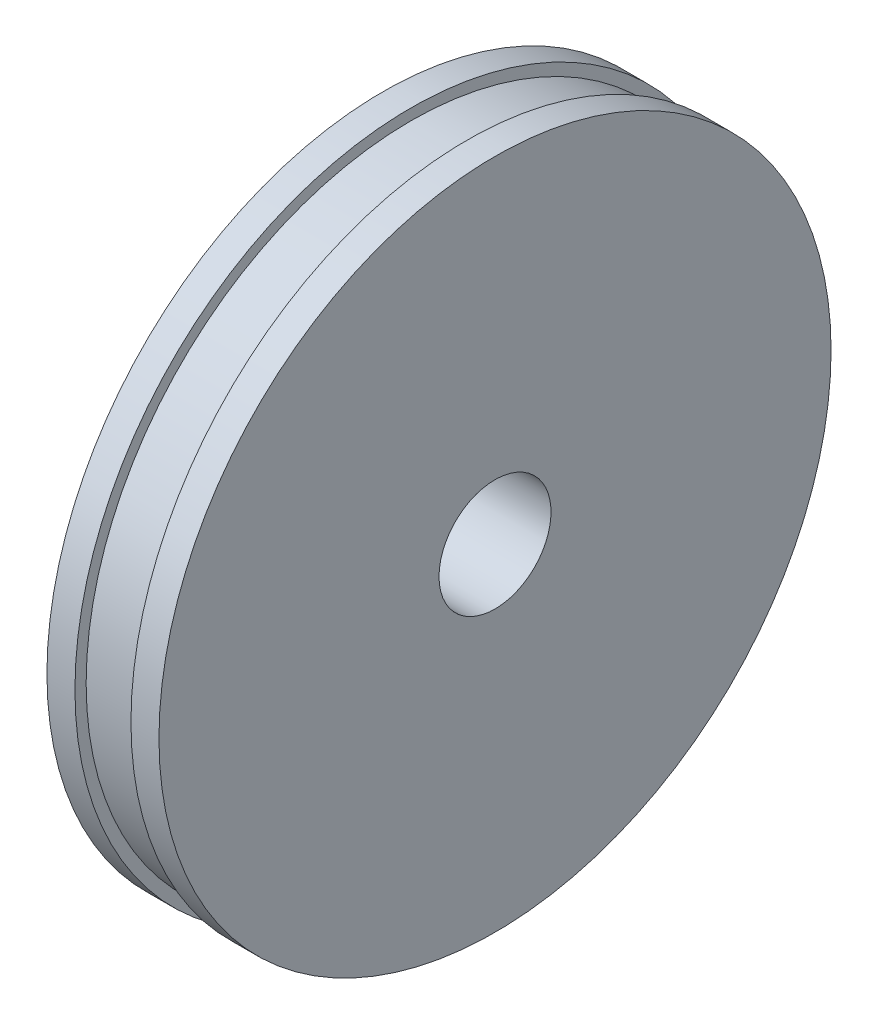
ISO-10303-21;
HEADER;
FILE_DESCRIPTION(('STEP AP214'),'2;1');
FILE_NAME('part.step','',(''),(''),'','','');
FILE_SCHEMA(('AUTOMOTIVE_DESIGN { 1 0 10303 214 1 1 1 1 }'));
ENDSEC;
DATA;
#1=APPLICATION_CONTEXT('core data for automotive mechanical design processes');
#2=APPLICATION_PROTOCOL_DEFINITION('international standard','automotive_design',2000,#1);
#3=PRODUCT_CONTEXT('',#1,'mechanical');
#4=PRODUCT('Part','Part','',(#3));
#5=PRODUCT_RELATED_PRODUCT_CATEGORY('part','',(#4));
#6=PRODUCT_DEFINITION_FORMATION('','',#4);
#7=PRODUCT_DEFINITION_CONTEXT('part definition',#1,'design');
#8=PRODUCT_DEFINITION('design','',#6,#7);
#9=PRODUCT_DEFINITION_SHAPE('','',#8);
#10=(LENGTH_UNIT() NAMED_UNIT(*) SI_UNIT(.MILLI.,.METRE.));
#11=(NAMED_UNIT(*) PLANE_ANGLE_UNIT() SI_UNIT($,.RADIAN.));
#12=(NAMED_UNIT(*) SI_UNIT($,.STERADIAN.) SOLID_ANGLE_UNIT());
#13=UNCERTAINTY_MEASURE_WITH_UNIT(LENGTH_MEASURE(1.E-05),#10,'distance_accuracy_value','');
#14=(GEOMETRIC_REPRESENTATION_CONTEXT(3) GLOBAL_UNCERTAINTY_ASSIGNED_CONTEXT((#13)) GLOBAL_UNIT_ASSIGNED_CONTEXT((#10,
#11,#12)) REPRESENTATION_CONTEXT('',''));
#15=CARTESIAN_POINT('',(0.,0.,0.));
#16=DIRECTION('',(0.,0.,1.));
#17=DIRECTION('',(1.,0.,0.));
#18=AXIS2_PLACEMENT_3D('',#15,#16,#17);
#19=CARTESIAN_POINT('',(0.,0.,0.));
#20=DIRECTION('',(1.,0.,0.));
#21=DIRECTION('',(0.,0.,-1.));
#22=AXIS2_PLACEMENT_3D('',#19,#20,#21);
#23=PLANE('',#22);
#24=CARTESIAN_POINT('',(0.,0.,0.));
#25=DIRECTION('',(-1.,0.,0.));
#26=DIRECTION('',(0.,0.,1.));
#27=AXIS2_PLACEMENT_3D('',#24,#25,#26);
#28=CIRCLE('',#27,50.);
#29=CARTESIAN_POINT('',(0.,0.,50.));
#30=VERTEX_POINT('',#29);
#31=EDGE_CURVE('E71',#30,#30,#28,.T.);
#32=ORIENTED_EDGE('',*,*,#31,.F.);
#33=EDGE_LOOP('',(#32));
#34=FACE_BOUND('',#33,.T.);
#35=CARTESIAN_POINT('',(0.,0.,0.));
#36=DIRECTION('',(-1.,0.,0.));
#37=DIRECTION('',(0.,0.,1.));
#38=AXIS2_PLACEMENT_3D('',#35,#36,#37);
#39=CIRCLE('',#38,300.);
#40=CARTESIAN_POINT('',(0.,0.,300.));
#41=VERTEX_POINT('',#40);
#42=EDGE_CURVE('E10',#41,#41,#39,.T.);
#43=ORIENTED_EDGE('',*,*,#42,.T.);
#44=EDGE_LOOP('',(#43));
#45=FACE_BOUND('',#44,.T.);
#46=ADVANCED_FACE('F39',(#34,#45),#23,.F.);
#47=CARTESIAN_POINT('',(0.,0.,0.));
#48=DIRECTION('',(-1.,0.,0.));
#49=DIRECTION('',(0.,0.,1.));
#50=AXIS2_PLACEMENT_3D('',#47,#48,#49);
#51=CYLINDRICAL_SURFACE('',#50,300.);
#52=ORIENTED_EDGE('',*,*,#42,.F.);
#53=EDGE_LOOP('',(#52));
#54=FACE_BOUND('',#53,.T.);
#55=CARTESIAN_POINT('',(25.,0.,0.));
#56=DIRECTION('',(-1.,0.,0.));
#57=DIRECTION('',(0.,0.,1.));
#58=AXIS2_PLACEMENT_3D('',#55,#56,#57);
#59=CIRCLE('',#58,300.);
#60=CARTESIAN_POINT('',(25.,0.,300.));
#61=VERTEX_POINT('',#60);
#62=EDGE_CURVE('E46',#61,#61,#59,.T.);
#63=ORIENTED_EDGE('',*,*,#62,.T.);
#64=EDGE_LOOP('',(#63));
#65=FACE_BOUND('',#64,.T.);
#66=ADVANCED_FACE('F89',(#54,#65),#51,.T.);
#67=CARTESIAN_POINT('',(25.,300.,0.));
#68=DIRECTION('',(-1.,0.,0.));
#69=DIRECTION('',(0.,0.,1.));
#70=AXIS2_PLACEMENT_3D('',#67,#68,#69);
#71=PLANE('',#70);
#72=ORIENTED_EDGE('',*,*,#62,.F.);
#73=EDGE_LOOP('',(#72));
#74=FACE_BOUND('',#73,.T.);
#75=CARTESIAN_POINT('',(25.,0.,0.));
#76=DIRECTION('',(-1.,0.,0.));
#77=DIRECTION('',(0.,0.,1.));
#78=AXIS2_PLACEMENT_3D('',#75,#76,#77);
#79=CIRCLE('',#78,290.);
#80=CARTESIAN_POINT('',(25.,0.,290.));
#81=VERTEX_POINT('',#80);
#82=EDGE_CURVE('E51',#81,#81,#79,.T.);
#83=ORIENTED_EDGE('',*,*,#82,.T.);
#84=EDGE_LOOP('',(#83));
#85=FACE_BOUND('',#84,.T.);
#86=ADVANCED_FACE('F93',(#74,#85),#71,.F.);
#87=CARTESIAN_POINT('',(0.,0.,0.));
#88=DIRECTION('',(-1.,0.,0.));
#89=DIRECTION('',(0.,0.,1.));
#90=AXIS2_PLACEMENT_3D('',#87,#88,#89);
#91=CYLINDRICAL_SURFACE('',#90,290.);
#92=ORIENTED_EDGE('',*,*,#82,.F.);
#93=EDGE_LOOP('',(#92));
#94=FACE_BOUND('',#93,.T.);
#95=CARTESIAN_POINT('',(75.,0.,0.));
#96=DIRECTION('',(-1.,0.,0.));
#97=DIRECTION('',(0.,0.,1.));
#98=AXIS2_PLACEMENT_3D('',#95,#96,#97);
#99=CIRCLE('',#98,290.);
#100=CARTESIAN_POINT('',(75.,0.,290.));
#101=VERTEX_POINT('',#100);
#102=EDGE_CURVE('E56',#101,#101,#99,.T.);
#103=ORIENTED_EDGE('',*,*,#102,.T.);
#104=EDGE_LOOP('',(#103));
#105=FACE_BOUND('',#104,.T.);
#106=ADVANCED_FACE('F98',(#94,#105),#91,.T.);
#107=CARTESIAN_POINT('',(75.,290.,0.));
#108=DIRECTION('',(1.,0.,0.));
#109=DIRECTION('',(0.,0.,-1.));
#110=AXIS2_PLACEMENT_3D('',#107,#108,#109);
#111=PLANE('',#110);
#112=ORIENTED_EDGE('',*,*,#102,.F.);
#113=EDGE_LOOP('',(#112));
#114=FACE_BOUND('',#113,.T.);
#115=CARTESIAN_POINT('',(75.,0.,0.));
#116=DIRECTION('',(-1.,0.,0.));
#117=DIRECTION('',(0.,0.,1.));
#118=AXIS2_PLACEMENT_3D('',#115,#116,#117);
#119=CIRCLE('',#118,300.);
#120=CARTESIAN_POINT('',(75.,0.,300.));
#121=VERTEX_POINT('',#120);
#122=EDGE_CURVE('E62',#121,#121,#119,.T.);
#123=ORIENTED_EDGE('',*,*,#122,.T.);
#124=EDGE_LOOP('',(#123));
#125=FACE_BOUND('',#124,.T.);
#126=ADVANCED_FACE('F104',(#114,#125),#111,.F.);
#127=CARTESIAN_POINT('',(0.,0.,0.));
#128=DIRECTION('',(-1.,0.,0.));
#129=DIRECTION('',(0.,0.,1.));
#130=AXIS2_PLACEMENT_3D('',#127,#128,#129);
#131=CYLINDRICAL_SURFACE('',#130,300.);
#132=ORIENTED_EDGE('',*,*,#122,.F.);
#133=EDGE_LOOP('',(#132));
#134=FACE_BOUND('',#133,.T.);
#135=CARTESIAN_POINT('',(100.,0.,0.));
#136=DIRECTION('',(-1.,0.,0.));
#137=DIRECTION('',(0.,0.,1.));
#138=AXIS2_PLACEMENT_3D('',#135,#136,#137);
#139=CIRCLE('',#138,300.);
#140=CARTESIAN_POINT('',(100.,0.,300.));
#141=VERTEX_POINT('',#140);
#142=EDGE_CURVE('E66',#141,#141,#139,.T.);
#143=ORIENTED_EDGE('',*,*,#142,.T.);
#144=EDGE_LOOP('',(#143));
#145=FACE_BOUND('',#144,.T.);
#146=ADVANCED_FACE('F108',(#134,#145),#131,.T.);
#147=CARTESIAN_POINT('',(100.,300.,0.));
#148=DIRECTION('',(-1.,0.,0.));
#149=DIRECTION('',(0.,0.,1.));
#150=AXIS2_PLACEMENT_3D('',#147,#148,#149);
#151=PLANE('',#150);
#152=CARTESIAN_POINT('',(100.,0.,0.));
#153=DIRECTION('',(-1.,0.,0.));
#154=DIRECTION('',(0.,0.,1.));
#155=AXIS2_PLACEMENT_3D('',#152,#153,#154);
#156=CIRCLE('',#155,50.);
#157=CARTESIAN_POINT('',(100.,0.,50.));
#158=VERTEX_POINT('',#157);
#159=EDGE_CURVE('E70',#158,#158,#156,.T.);
#160=ORIENTED_EDGE('',*,*,#159,.T.);
#161=EDGE_LOOP('',(#160));
#162=FACE_BOUND('',#161,.T.);
#163=ORIENTED_EDGE('',*,*,#142,.F.);
#164=EDGE_LOOP('',(#163));
#165=FACE_BOUND('',#164,.T.);
#166=ADVANCED_FACE('F79',(#162,#165),#151,.F.);
#167=CARTESIAN_POINT('',(100.,0.,0.));
#168=DIRECTION('',(-1.,0.,0.));
#169=DIRECTION('',(0.,0.,1.));
#170=AXIS2_PLACEMENT_3D('',#167,#168,#169);
#171=CYLINDRICAL_SURFACE('',#170,50.);
#172=ORIENTED_EDGE('',*,*,#159,.F.);
#173=EDGE_LOOP('',(#172));
#174=FACE_BOUND('',#173,.T.);
#175=ORIENTED_EDGE('',*,*,#31,.T.);
#176=EDGE_LOOP('',(#175));
#177=FACE_BOUND('',#176,.T.);
#178=ADVANCED_FACE('F82',(#174,#177),#171,.F.);
#179=CLOSED_SHELL('',(#46,#66,#86,#106,#126,#146,#166,#178));
#180=MANIFOLD_SOLID_BREP('B2',#179);
#181=ADVANCED_BREP_SHAPE_REPRESENTATION('',(#18,#180),#14);
#182=SHAPE_DEFINITION_REPRESENTATION(#9,#181);
ENDSEC;
END-ISO-10303-21;
